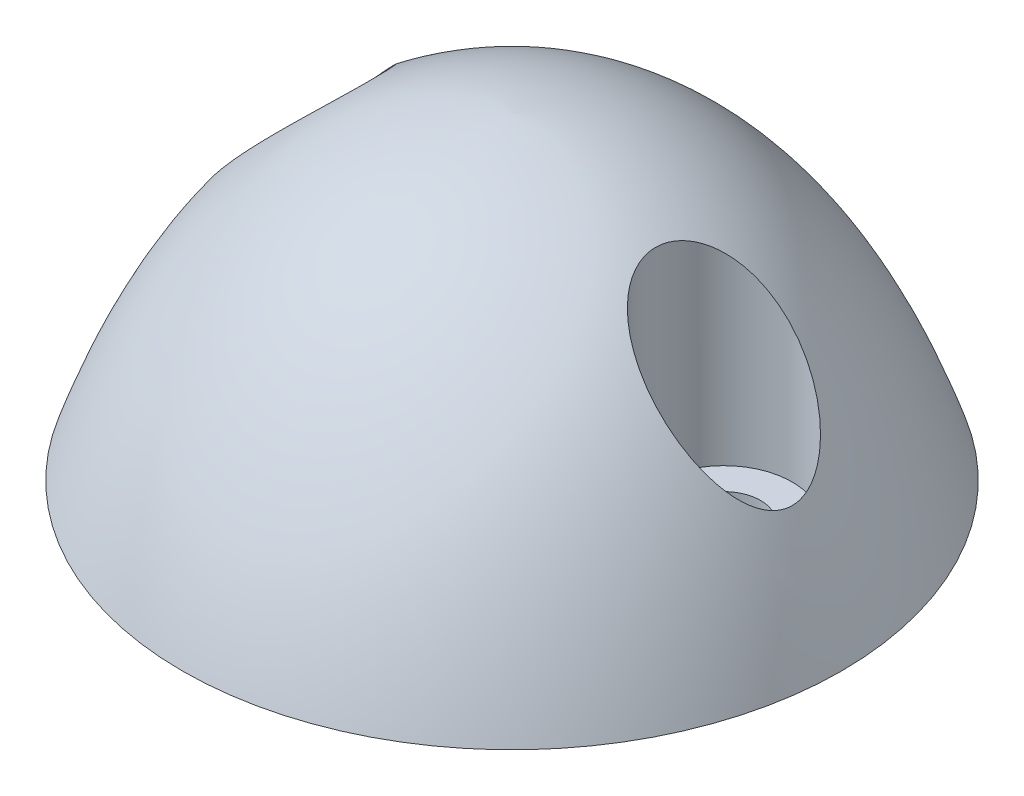
ISO-10303-21;
HEADER;
FILE_DESCRIPTION(('STEP AP214'),'2;1');
FILE_NAME('part.step','',(''),(''),'','','');
FILE_SCHEMA(('AUTOMOTIVE_DESIGN { 1 0 10303 214 1 1 1 1 }'));
ENDSEC;
DATA;
#1=APPLICATION_CONTEXT('core data for automotive mechanical design processes');
#2=APPLICATION_PROTOCOL_DEFINITION('international standard','automotive_design',2000,#1);
#3=PRODUCT_CONTEXT('',#1,'mechanical');
#4=PRODUCT('Part','Part','',(#3));
#5=PRODUCT_RELATED_PRODUCT_CATEGORY('part','',(#4));
#6=PRODUCT_DEFINITION_FORMATION('','',#4);
#7=PRODUCT_DEFINITION_CONTEXT('part definition',#1,'design');
#8=PRODUCT_DEFINITION('design','',#6,#7);
#9=PRODUCT_DEFINITION_SHAPE('','',#8);
#10=(LENGTH_UNIT() NAMED_UNIT(*) SI_UNIT(.MILLI.,.METRE.));
#11=(NAMED_UNIT(*) PLANE_ANGLE_UNIT() SI_UNIT($,.RADIAN.));
#12=(NAMED_UNIT(*) SI_UNIT($,.STERADIAN.) SOLID_ANGLE_UNIT());
#13=UNCERTAINTY_MEASURE_WITH_UNIT(LENGTH_MEASURE(1.E-05),#10,'distance_accuracy_value','');
#14=(GEOMETRIC_REPRESENTATION_CONTEXT(3) GLOBAL_UNCERTAINTY_ASSIGNED_CONTEXT((#13)) GLOBAL_UNIT_ASSIGNED_CONTEXT((#10,
#11,#12)) REPRESENTATION_CONTEXT('',''));
#15=CARTESIAN_POINT('',(0.,0.,0.));
#16=DIRECTION('',(0.,0.,1.));
#17=DIRECTION('',(1.,0.,0.));
#18=AXIS2_PLACEMENT_3D('',#15,#16,#17);
#19=CARTESIAN_POINT('',(-9.,20.,0.));
#20=DIRECTION('',(0.,-1.,0.));
#21=DIRECTION('',(0.,0.,-1.));
#22=AXIS2_PLACEMENT_3D('',#19,#20,#21);
#23=CYLINDRICAL_SURFACE('',#22,1.55);
#24=CARTESIAN_POINT('',(-9.,0.,0.));
#25=DIRECTION('',(0.,1.,0.));
#26=DIRECTION('',(0.,0.,-1.));
#27=AXIS2_PLACEMENT_3D('',#24,#25,#26);
#28=CIRCLE('',#27,1.55);
#29=CARTESIAN_POINT('',(-9.,0.,-1.55));
#30=VERTEX_POINT('',#29);
#31=EDGE_CURVE('E143',#30,#30,#28,.T.);
#32=ORIENTED_EDGE('',*,*,#31,.F.);
#33=EDGE_LOOP('',(#32));
#34=FACE_BOUND('',#33,.T.);
#35=CARTESIAN_POINT('',(-9.,3.,0.));
#36=DIRECTION('',(0.,1.,0.));
#37=DIRECTION('',(0.,0.,1.));
#38=AXIS2_PLACEMENT_3D('',#35,#36,#37);
#39=CIRCLE('',#38,1.55);
#40=CARTESIAN_POINT('',(-9.,3.,1.55));
#41=VERTEX_POINT('',#40);
#42=EDGE_CURVE('E124',#41,#41,#39,.T.);
#43=ORIENTED_EDGE('',*,*,#42,.T.);
#44=EDGE_LOOP('',(#43));
#45=FACE_BOUND('',#44,.T.);
#46=ADVANCED_FACE('F36',(#34,#45),#23,.F.);
#47=CARTESIAN_POINT('',(9.,20.,0.));
#48=DIRECTION('',(0.,-1.,0.));
#49=DIRECTION('',(0.,0.,-1.));
#50=AXIS2_PLACEMENT_3D('',#47,#48,#49);
#51=CYLINDRICAL_SURFACE('',#50,1.55);
#52=CARTESIAN_POINT('',(9.,0.,0.));
#53=DIRECTION('',(0.,1.,0.));
#54=DIRECTION('',(0.,0.,1.));
#55=AXIS2_PLACEMENT_3D('',#52,#53,#54);
#56=CIRCLE('',#55,1.55);
#57=CARTESIAN_POINT('',(9.,0.,1.55));
#58=VERTEX_POINT('',#57);
#59=EDGE_CURVE('E139',#58,#58,#56,.T.);
#60=ORIENTED_EDGE('',*,*,#59,.F.);
#61=EDGE_LOOP('',(#60));
#62=FACE_BOUND('',#61,.T.);
#63=CARTESIAN_POINT('',(9.,3.,0.));
#64=DIRECTION('',(0.,1.,0.));
#65=DIRECTION('',(0.,0.,1.));
#66=AXIS2_PLACEMENT_3D('',#63,#64,#65);
#67=CIRCLE('',#66,1.55);
#68=CARTESIAN_POINT('',(9.,3.,1.55));
#69=VERTEX_POINT('',#68);
#70=EDGE_CURVE('E126',#69,#69,#67,.T.);
#71=ORIENTED_EDGE('',*,*,#70,.T.);
#72=EDGE_LOOP('',(#71));
#73=FACE_BOUND('',#72,.T.);
#74=ADVANCED_FACE('F61',(#62,#73),#51,.F.);
#75=CARTESIAN_POINT('',(14.,0.,0.));
#76=CARTESIAN_POINT('',(9.75434257479276,12.950892032801,0.));
#77=CARTESIAN_POINT('',(0.,13.5,0.));
#78=B_SPLINE_CURVE_WITH_KNOTS('',2,(#75,#76,#77),.UNSPECIFIED.,.F.,.F.,(3,3),(0.,
0.755787305637426),.UNSPECIFIED.);
#79=CARTESIAN_POINT('',(0.,13.5,0.));
#80=DIRECTION('',(0.,1.,0.));
#81=AXIS1_PLACEMENT('',#79,#80);
#82=SURFACE_OF_REVOLUTION('',#78,#81);
#83=CARTESIAN_POINT('',(11.9,5.03290150704501,0.));
#84=CARTESIAN_POINT('',(11.8999995040046,5.03290226004967,0.0575568858720775));
#85=CARTESIAN_POINT('',(11.8982813229144,5.03535409608747,0.115121077812123));
#86=CARTESIAN_POINT('',(11.8914616033101,5.04507908203782,0.229664148234314));
#87=CARTESIAN_POINT('',(11.8863580285262,5.05235513365148,0.286642653474701));
#88=CARTESIAN_POINT('',(11.872907146739,5.07150977637272,0.399553128216967));
#89=CARTESIAN_POINT('',(11.8645529622686,5.08339812577846,0.455482613504032));
#90=CARTESIAN_POINT('',(11.8448344448537,5.11141478978463,0.565739911087259));
#91=CARTESIAN_POINT('',(11.8334682211272,5.12754576761097,0.620066693410804));
#92=CARTESIAN_POINT('',(11.792714499306,5.18527229662395,0.790732279385448));
#93=CARTESIAN_POINT('',(11.7580499235625,5.23422379358047,0.903394729899455));
#94=CARTESIAN_POINT('',(11.6784853399038,5.34589010844884,1.11751706674101));
#95=CARTESIAN_POINT('',(11.6335746123927,5.40861933814031,1.21896505422312));
#96=CARTESIAN_POINT('',(11.5475295488657,5.52795449122324,1.38810470297556));
#97=CARTESIAN_POINT('',(11.5080079693762,5.58250819283202,1.45811047024882));
#98=CARTESIAN_POINT('',(11.42521958617,5.69613318024085,1.59201508297687));
#99=CARTESIAN_POINT('',(11.3819508483381,5.75520679716404,1.65591073843177));
#100=CARTESIAN_POINT('',(11.2922410035893,5.87694345513667,1.77802731405435));
#101=CARTESIAN_POINT('',(11.2457943988602,5.93961268485598,1.83623795403757));
#102=CARTESIAN_POINT('',(11.1502617746131,6.06769619684007,1.94723797681841));
#103=CARTESIAN_POINT('',(11.1011748939948,6.13311137312243,2.00002557440872));
#104=CARTESIAN_POINT('',(10.9707094187621,6.305832306879,2.13053990078735));
#105=CARTESIAN_POINT('',(10.8875671757691,6.41480535337763,2.2043131059503));
#106=CARTESIAN_POINT('',(10.7165788326061,6.63644901559209,2.33992847582749));
#107=CARTESIAN_POINT('',(10.6287300465817,6.74912172806716,2.40176373331069));
#108=CARTESIAN_POINT('',(10.4490309695116,6.97699478046377,2.51426994545458));
#109=CARTESIAN_POINT('',(10.3571770786878,7.09219734605431,2.56493059791662));
#110=CARTESIAN_POINT('',(10.1701452769849,7.32406718010042,2.6554756805126));
#111=CARTESIAN_POINT('',(10.0749679821283,7.44073417456999,2.69536209589872));
#112=CARTESIAN_POINT('',(9.87739154858158,7.68009120807085,2.76616823983219));
#113=CARTESIAN_POINT('',(9.77486027344762,7.80281566009319,2.79660265234559));
#114=CARTESIAN_POINT('',(9.56715900286346,8.04835924926728,2.84600173411843));
#115=CARTESIAN_POINT('',(9.46198873312454,8.17117839496452,2.86496520593894));
#116=CARTESIAN_POINT('',(9.24957393129934,8.41616784239128,2.89122090802685));
#117=CARTESIAN_POINT('',(9.14233047258101,8.53833844023502,2.8985190223286));
#118=CARTESIAN_POINT('',(8.92628770747958,8.78140738826954,2.90107506219991));
#119=CARTESIAN_POINT('',(8.81748862847892,8.90230592000105,2.896334729876));
#120=CARTESIAN_POINT('',(8.61199355814732,9.12784336282508,2.87555249191891));
#121=CARTESIAN_POINT('',(8.51540020508739,9.23270312602553,2.86092458357419));
#122=CARTESIAN_POINT('',(8.32209546554788,9.44030517391013,2.82137985079996));
#123=CARTESIAN_POINT('',(8.22538407244338,9.54304733335419,2.79646241964657));
#124=CARTESIAN_POINT('',(7.93619523259951,9.84699766331794,2.70539063195993));
#125=CARTESIAN_POINT('',(7.74426572005998,10.0443652409202,2.62288206651332));
#126=CARTESIAN_POINT('',(7.42421227937834,10.3670691331181,2.43936049391355));
#127=CARTESIAN_POINT('',(7.29357375799181,10.4968316224509,2.35043815627106));
#128=CARTESIAN_POINT('',(7.04189937685823,10.7436097469304,2.14525345401028));
#129=CARTESIAN_POINT('',(6.92085030648059,10.8606430041146,2.02902960828574));
#130=CARTESIAN_POINT('',(6.72051281177229,11.0522047445567,1.7976967701513));
#131=CARTESIAN_POINT('',(6.63799825520511,11.1303382921376,1.68838570589615));
#132=CARTESIAN_POINT('',(6.4862838503991,11.2729744063817,1.45285213396045));
#133=CARTESIAN_POINT('',(6.41706813508356,11.3374932261626,1.3266500882188));
#134=CARTESIAN_POINT('',(6.30639710237747,11.4401117670638,1.0814153834397));
#135=CARTESIAN_POINT('',(6.26223606365433,11.4808242087681,0.964705778915558));
#136=CARTESIAN_POINT('',(6.18870295877073,11.5484156237527,0.722873049050717));
#137=CARTESIAN_POINT('',(6.15932314563794,11.5753018436432,0.59775437004307));
#138=CARTESIAN_POINT('',(6.11728138156712,11.6137271740099,0.341790474398184));
#139=CARTESIAN_POINT('',(6.10469629176645,11.6251957272083,0.210921741889061));
#140=CARTESIAN_POINT('',(6.09748911061471,11.6317671435189,-0.0517177970447902));
#141=CARTESIAN_POINT('',(6.10286374222704,11.6268729922664,-0.183488434524143));
#142=CARTESIAN_POINT('',(6.13003147631084,11.6020762132863,-0.433439045067222));
#143=CARTESIAN_POINT('',(6.15052839634535,11.5833583415724,-0.551884194652133));
#144=CARTESIAN_POINT('',(6.20512330549232,11.533331640864,-0.782781415397064));
#145=CARTESIAN_POINT('',(6.23922262483345,11.5020215804306,-0.895232899194845));
#146=CARTESIAN_POINT('',(6.32124168574624,11.42636170307,-1.11759801277993));
#147=CARTESIAN_POINT('',(6.36978827522938,11.3814181093387,-1.22707506413123));
#148=CARTESIAN_POINT('',(6.47747036539064,11.2811239211568,-1.43549071241328));
#149=CARTESIAN_POINT('',(6.53661188450636,11.2257674107622,-1.53442326834299));
#150=CARTESIAN_POINT('',(6.69391632522174,11.077489336817,-1.76635133409484));
#151=CARTESIAN_POINT('',(6.79710345559261,10.9793608211182,-1.89263106395647));
#152=CARTESIAN_POINT('',(7.01557837077803,10.7690312516977,-2.12064277957733));
#153=CARTESIAN_POINT('',(7.13089249203731,10.6567994621811,-2.2223196867994));
#154=CARTESIAN_POINT('',(7.41397371211287,10.377586384592,-2.43656974789653));
#155=CARTESIAN_POINT('',(7.58506184969193,10.2059716160231,-2.53867744586831));
#156=CARTESIAN_POINT('',(7.93287815216935,9.8501545001175,-2.70340022901078));
#157=CARTESIAN_POINT('',(8.10961342663572,9.66593592310586,-2.76596329076319));
#158=CARTESIAN_POINT('',(8.40504277555176,9.35177508624945,-2.84094328587919));
#159=CARTESIAN_POINT('',(8.52367028973248,9.22395281755344,-2.86309133018028));
#160=CARTESIAN_POINT('',(8.76009393047977,8.9657632850277,-2.89251518105661));
#161=CARTESIAN_POINT('',(8.87788975717318,8.83539516128184,-2.89978587160415));
#162=CARTESIAN_POINT('',(9.11194662487995,8.57285428163703,-2.90020522777573));
#163=CARTESIAN_POINT('',(9.22820431818485,8.44067856335935,-2.89332698982772));
#164=CARTESIAN_POINT('',(9.45823718061007,8.17562720564306,-2.86590890298483));
#165=CARTESIAN_POINT('',(9.57201269873692,8.04275166790694,-2.84537098766408));
#166=CARTESIAN_POINT('',(9.79829571018505,7.77496136597528,-2.79043050792275));
#167=CARTESIAN_POINT('',(9.91075217304876,7.64004872724085,-2.75580705503008));
#168=CARTESIAN_POINT('',(10.1318318510806,7.37129325698135,-2.67262278312493));
#169=CARTESIAN_POINT('',(10.2404538780307,7.23745076684238,-2.62405768570794));
#170=CARTESIAN_POINT('',(10.4527688013552,6.97244371475256,-2.51272649215602));
#171=CARTESIAN_POINT('',(10.556475060083,6.84127252066054,-2.45000192465136));
#172=CARTESIAN_POINT('',(10.7582585417007,6.58286209454022,-2.30946665529553));
#173=CARTESIAN_POINT('',(10.8563404094278,6.45561965927966,-2.23166864115529));
#174=CARTESIAN_POINT('',(11.0448234007733,6.20820520126674,-2.06029149472453));
#175=CARTESIAN_POINT('',(11.1352811881499,6.08798352992978,-1.96684777668241));
#176=CARTESIAN_POINT('',(11.3073420294809,5.85682886918703,-1.76183817791076));
#177=CARTESIAN_POINT('',(11.3889511105228,5.74588956922313,-1.65028476315387));
#178=CARTESIAN_POINT('',(11.5248547528227,5.55940285070756,-1.43116551376374));
#179=CARTESIAN_POINT('',(11.5813493862281,5.48121204395829,-1.32725258017546));
#180=CARTESIAN_POINT('',(11.6837544040384,5.33858319837821,-1.10558161710211));
#181=CARTESIAN_POINT('',(11.7296826341018,5.27412198543189,-0.987847446045542));
#182=CARTESIAN_POINT('',(11.7966797170578,5.17967019789641,-0.773004766691707));
#183=CARTESIAN_POINT('',(11.8211122976449,5.1450730008013,-0.67901684231861));
#184=CARTESIAN_POINT('',(11.8508492614395,5.1028740056708,-0.5339467380487));
#185=CARTESIAN_POINT('',(11.8596056617471,5.09042944853154,-0.484946498380702));
#186=CARTESIAN_POINT('',(11.8746555313529,5.06902210293588,-0.385828198747395));
#187=CARTESIAN_POINT('',(11.8809500699978,5.06005780278998,-0.335710634130438));
#188=CARTESIAN_POINT('',(11.8905933703735,5.04631743021795,-0.238134399020383));
#189=CARTESIAN_POINT('',(11.8941134537166,5.0412978462236,-0.190726895765388));
#190=CARTESIAN_POINT('',(11.8988172969419,5.03458911230848,-0.095548004241633));
#191=CARTESIAN_POINT('',(11.9000004117133,5.03290088199484,-0.047776519149393));
#192=CARTESIAN_POINT('',(11.9,5.03290150704501,0.));
#193=B_SPLINE_CURVE_WITH_KNOTS('',3,(#83,#84,#85,#86,#87,#88,#89,#90,#91,#92,#93,#94,#95,#96,
#97,#98,#99,#100,#101,#102,#103,#104,#105,#106,#107,#108,#109,#110,#111,#112,#113,#114,#115,
#116,#117,#118,#119,#120,#121,#122,#123,#124,#125,#126,#127,#128,#129,#130,#131,#132,#133,#134,
#135,#136,#137,#138,#139,#140,#141,#142,#143,#144,#145,#146,#147,#148,#149,#150,#151,#152,#153,
#154,#155,#156,#157,#158,#159,#160,#161,#162,#163,#164,#165,#166,#167,#168,#169,#170,#171,#172,
#173,#174,#175,#176,#177,#178,#179,#180,#181,#182,#183,#184,#185,#186,#187,#188,#189,#190,#191,
#192),.UNSPECIFIED.,.T.,.F.,(4,2,2,2,2,2,2,2,2,2,2,2,2,2,2,2,2,2,2,2,2,2,2,2,2,2,2,2,2,2,2,2,2,
2,2,2,2,2,2,2,2,2,2,2,2,2,2,2,2,2,2,2,2,2,4),(0.,0.172606638086496,0.345317191055014,
0.518395160362628,0.691582036321827,1.07223850390679,1.45329505819107,1.74436460868284,
2.03558530202011,2.32732321892387,2.61915686714067,3.08543112294399,3.55197435921418,
4.01894593424168,4.4858314066814,4.97376557624021,5.46175067192655,5.94948954899662,
6.43715784846712,6.86671585488696,7.29629919390324,8.15371061882406,8.76525661285859,
9.37594492261122,9.84727471254404,10.318038610359,10.7101756087908,11.1021068700587,
11.4958257249137,11.8894727434295,12.2528067961836,12.6161763894254,12.9984550148206,
13.3809514857205,13.9487416747951,14.5177914577979,15.3024264797262,16.0880916008878,
16.6148404999769,17.141770507173,17.6697033749526,18.1975615279266,18.734037827224,
19.270678936401,19.8057661096245,20.3404048275818,20.8706351291568,21.400501977617,
21.8245484007901,22.247873304218,22.5558559888926,22.709619549754,22.8633162467272,
23.006553128726,23.1498295451774),.UNSPECIFIED.);
#194=CARTESIAN_POINT('',(11.9,5.03290150704501,0.));
#195=VERTEX_POINT('',#194);
#196=EDGE_CURVE('E42',#195,#195,#193,.T.);
#197=ORIENTED_EDGE('',*,*,#196,.T.);
#198=EDGE_LOOP('',(#197));
#199=FACE_BOUND('',#198,.T.);
#200=CARTESIAN_POINT('',(-9.,8.69842329847387,2.9));
#201=CARTESIAN_POINT('',(-9.12448510729692,8.55873330846458,2.9000001011647));
#202=CARTESIAN_POINT('',(-9.24796583434249,8.41816990724993,2.89199885836156));
#203=CARTESIAN_POINT('',(-9.49215204243595,8.13622368675681,2.86058538998337));
#204=CARTESIAN_POINT('',(-9.61285592943217,7.99484045241448,2.83716453047458));
#205=CARTESIAN_POINT('',(-9.85083651934552,7.71214669285684,2.77510813407083));
#206=CARTESIAN_POINT('',(-9.96810759645478,7.57083662320212,2.73644897638312));
#207=CARTESIAN_POINT('',(-10.1982127414698,7.28971006085866,2.64379787619063));
#208=CARTESIAN_POINT('',(-10.3110490570052,7.14989283843299,2.58981381779027));
#209=CARTESIAN_POINT('',(-10.4949257596172,6.91897707961231,2.48643110183772));
#210=CARTESIAN_POINT('',(-10.5674402219199,6.8270683979875,2.44142725208581));
#211=CARTESIAN_POINT('',(-10.7097420841086,6.64511767381186,2.34397514824067));
#212=CARTESIAN_POINT('',(-10.7795301076142,6.55507520663945,2.29152860938174));
#213=CARTESIAN_POINT('',(-10.9158279299489,6.37771909841621,2.17885493054948));
#214=CARTESIAN_POINT('',(-10.9823436918103,6.29040060846993,2.11864272687756));
#215=CARTESIAN_POINT('',(-11.1116233239222,6.11930646246552,1.98981611803067));
#216=CARTESIAN_POINT('',(-11.1743888073324,6.03552928773523,1.92120536472756));
#217=CARTESIAN_POINT('',(-11.3121848766939,5.85019068635881,1.75457482430437));
#218=CARTESIAN_POINT('',(-11.3858018700371,5.75012491967928,1.65367129624899));
#219=CARTESIAN_POINT('',(-11.5231718207271,5.56178655953503,1.43533783139592));
#220=CARTESIAN_POINT('',(-11.586937518179,5.47349875484772,1.31792962109465));
#221=CARTESIAN_POINT('',(-11.6855542424866,5.33601177605859,1.0991349686905));
#222=CARTESIAN_POINT('',(-11.7235818340442,5.28266652715065,1.00182109634282));
#223=CARTESIAN_POINT('',(-11.7900815656988,5.18901205963675,0.798044472561981));
#224=CARTESIAN_POINT('',(-11.8185688571437,5.14868217452862,0.691596568325083));
#225=CARTESIAN_POINT('',(-11.8598273659685,5.09013353105925,0.490003722057058));
#226=CARTESIAN_POINT('',(-11.8744433791839,5.06932650430412,0.395998621332511));
#227=CARTESIAN_POINT('',(-11.8943303993547,5.04099479902677,0.205041413451809));
#228=CARTESIAN_POINT('',(-11.8996083113375,5.03346030619202,0.108091537805095));
#229=CARTESIAN_POINT('',(-11.9003498519939,5.03240239543953,-0.0860615957148231));
#230=CARTESIAN_POINT('',(-11.8957997329298,5.03889860407731,-0.183265018306169));
#231=CARTESIAN_POINT('',(-11.8772790244393,5.06528896878518,-0.374912098258223));
#232=CARTESIAN_POINT('',(-11.86330166158,5.08519275812969,-0.469353720337511));
#233=CARTESIAN_POINT('',(-11.8228365300349,5.14263647838467,-0.674454364161071));
#234=CARTESIAN_POINT('',(-11.7942091206407,5.18318211229241,-0.783840027486329));
#235=CARTESIAN_POINT('',(-11.7268878561303,5.27802567647299,-0.993092269941708));
#236=CARTESIAN_POINT('',(-11.6881755433804,5.33234881780208,-1.0929409314527));
#237=CARTESIAN_POINT('',(-11.5824030438294,5.47983248779801,-1.32853261541468));
#238=CARTESIAN_POINT('',(-11.5106767994087,5.57908630945384,-1.45835381689625));
#239=CARTESIAN_POINT('',(-11.3943311705771,5.73830486614203,-1.63776458755625));
#240=CARTESIAN_POINT('',(-11.3540232669175,5.79319025517631,-1.69508863475426));
#241=CARTESIAN_POINT('',(-11.2708793833188,5.90577363488374,-1.80495071907319));
#242=CARTESIAN_POINT('',(-11.2280439463663,5.96347102099915,-1.85748977802263));
#243=CARTESIAN_POINT('',(-11.1132205591229,6.11723261687759,-1.98895228563047));
#244=CARTESIAN_POINT('',(-11.0394900870734,6.21509082863494,-2.06425518541376));
#245=CARTESIAN_POINT('',(-10.887458097297,6.41487047950113,-2.20412600179048));
#246=CARTESIAN_POINT('',(-10.8091539432783,6.51679425106915,-2.26868764290317));
#247=CARTESIAN_POINT('',(-10.6486218005365,6.72360907988575,-2.38789768584219));
#248=CARTESIAN_POINT('',(-10.5663876114612,6.82850471202094,-2.44252972292443));
#249=CARTESIAN_POINT('',(-10.39869142744,7.04016885655036,-2.5422778254084));
#250=CARTESIAN_POINT('',(-10.3132297686568,7.14693717327496,-2.5873948786539));
#251=CARTESIAN_POINT('',(-10.1135896772915,7.39368643560337,-2.68056178296421));
#252=CARTESIAN_POINT('',(-9.99844656022324,7.53407839372526,-2.72547517734341));
#253=CARTESIAN_POINT('',(-9.76421764548896,7.81564547944351,-2.80019355126723));
#254=CARTESIAN_POINT('',(-9.64513051416806,7.95682085823639,-2.82999336347353));
#255=CARTESIAN_POINT('',(-9.40383847881979,8.23880520032355,-2.87436146910663));
#256=CARTESIAN_POINT('',(-9.28163488661342,8.37961429116752,-2.88893606635744));
#257=CARTESIAN_POINT('',(-9.03489368597974,8.65987744341655,-2.90242039513778));
#258=CARTESIAN_POINT('',(-8.91035687921974,8.79933194611392,-2.90133541201009));
#259=CARTESIAN_POINT('',(-8.68693824259828,9.04597178500572,-2.88473147836369));
#260=CARTESIAN_POINT('',(-8.58832917763504,9.15361704416557,-2.8723829234742));
#261=CARTESIAN_POINT('',(-8.39081074220017,9.3668700690969,-2.83706930075181));
#262=CARTESIAN_POINT('',(-8.29190129645239,9.47247726514322,-2.8141013078662));
#263=CARTESIAN_POINT('',(-7.99601656987991,9.78494322230222,-2.72839506718531));
#264=CARTESIAN_POINT('',(-7.79935439930493,9.98803124773744,-2.6488222489451));
#265=CARTESIAN_POINT('',(-7.47172243862462,10.3195723758196,-2.46948304527565));
#266=CARTESIAN_POINT('',(-7.33832095095661,10.4525186293702,-2.38237381573766));
#267=CARTESIAN_POINT('',(-7.08079716527253,10.7057807401837,-2.18022249701755));
#268=CARTESIAN_POINT('',(-6.95666307301617,10.826112732791,-2.06521673140881));
#269=CARTESIAN_POINT('',(-6.75080997942218,11.0233942587739,-1.83552803242699));
#270=CARTESIAN_POINT('',(-6.66589653138417,11.1039608132096,-1.72683430654452));
#271=CARTESIAN_POINT('',(-6.50926686181718,11.2514734219483,-1.492008944954));
#272=CARTESIAN_POINT('',(-6.43753437260492,11.3184362766035,-1.36589914531352));
#273=CARTESIAN_POINT('',(-6.32255645305477,11.4251764808895,-1.12086496795616));
#274=CARTESIAN_POINT('',(-6.27653436269791,11.4676476416399,-1.00442627377986));
#275=CARTESIAN_POINT('',(-6.19922643437051,11.538766948671,-0.762713014147444));
#276=CARTESIAN_POINT('',(-6.16793287775602,11.5674223354468,-0.637443116443457));
#277=CARTESIAN_POINT('',(-6.1221223246944,11.6093106283949,-0.380658401453586));
#278=CARTESIAN_POINT('',(-6.10768821620221,11.6224673394075,-0.249116011926466));
#279=CARTESIAN_POINT('',(-6.09702610249772,11.6321896881081,0.0153129339856148));
#280=CARTESIAN_POINT('',(-6.10079379144253,11.6287592496754,0.148199165047576));
#281=CARTESIAN_POINT('',(-6.12514683303992,11.606536433718,0.399845142024661));
#282=CARTESIAN_POINT('',(-6.1443144555643,11.5890389924552,0.518863786472987));
#283=CARTESIAN_POINT('',(-6.19643761995362,11.5413004798469,0.7511413042901));
#284=CARTESIAN_POINT('',(-6.22939442241935,11.5110582433761,0.864399649992914));
#285=CARTESIAN_POINT('',(-6.30902777359417,11.4376519041741,1.08782886011366));
#286=CARTESIAN_POINT('',(-6.35625825023303,11.3939644497066,1.19762737846344));
#287=CARTESIAN_POINT('',(-6.4614159382425,11.296118733526,1.40688777999697));
#288=CARTESIAN_POINT('',(-6.5193486309413,11.2419551055854,1.50634432537674));
#289=CARTESIAN_POINT('',(-6.67321457615494,11.0971004184923,1.73886790734485));
#290=CARTESIAN_POINT('',(-6.77412781675902,11.0012788093418,1.86546285294304));
#291=CARTESIAN_POINT('',(-6.98821672952603,10.7955326700133,2.09462259189682));
#292=CARTESIAN_POINT('',(-7.10142123492332,10.6855748625276,2.19712901579074));
#293=CARTESIAN_POINT('',(-7.37955123807355,10.4118575045609,2.41368231755852));
#294=CARTESIAN_POINT('',(-7.54786723654031,10.2434590503017,2.51747435129955));
#295=CARTESIAN_POINT('',(-7.89033474347203,9.89412389891072,2.6861004728214));
#296=CARTESIAN_POINT('',(-8.06448860942675,9.71318210415313,2.75091861682486));
#297=CARTESIAN_POINT('',(-8.36631443019452,9.39334703958306,2.83298939941445));
#298=CARTESIAN_POINT('',(-8.49383965805994,9.25629252572266,2.85835975277461));
#299=CARTESIAN_POINT('',(-8.74791691877183,8.97926213668433,2.89186345249751));
#300=CARTESIAN_POINT('',(-8.87446912251549,8.83928679132402,2.89999989798544));
#301=CARTESIAN_POINT('',(-9.,8.69842329847387,2.9));
#302=B_SPLINE_CURVE_WITH_KNOTS('',3,(#200,#201,#202,#203,#204,#205,#206,#207,#208,#209,#210,
#211,#212,#213,#214,#215,#216,#217,#218,#219,#220,#221,#222,#223,#224,#225,#226,#227,#228,#229,
#230,#231,#232,#233,#234,#235,#236,#237,#238,#239,#240,#241,#242,#243,#244,#245,#246,#247,#248,
#249,#250,#251,#252,#253,#254,#255,#256,#257,#258,#259,#260,#261,#262,#263,#264,#265,#266,#267,
#268,#269,#270,#271,#272,#273,#274,#275,#276,#277,#278,#279,#280,#281,#282,#283,#284,#285,#286,
#287,#288,#289,#290,#291,#292,#293,#294,#295,#296,#297,#298,#299,#300,#301),.UNSPECIFIED.,.T.,
.F.,(4,2,2,2,2,2,2,2,2,2,2,2,2,2,2,2,2,2,2,2,2,2,2,2,2,2,2,2,2,2,2,2,2,2,2,2,2,2,2,2,2,2,2,2,2,
2,2,2,2,2,4),(0.,0.561140498625367,1.12259546518618,1.68492418396424,2.24696412771572,
2.62300443142193,2.99895821358937,3.37419938781156,3.74927797477348,4.22817150935372,
4.70644043893967,5.05721191953259,5.40742365391509,5.69831099534556,5.98898315107284,
6.28006217082226,6.57135055266486,6.929714344802,7.28873868817006,7.82096530035851,
8.08787553990295,8.35472864677744,8.7855243294195,9.2165708232622,9.64832139734102,
10.0800271250688,10.6404506174283,11.2010655897968,11.7614483539156,12.3216419848874,
12.7607571949328,13.1999934284277,14.0761175276284,14.6967297645114,15.3165382107832,
15.7940307565724,16.2709299730431,16.6659245867286,17.0607119681824,17.4574322236706,
17.8540586350511,18.2178580943096,18.5816908192244,18.9620069884954,19.3425184861477,
19.9037553867706,20.4663385249426,21.241327204076,22.0166327069899,22.5825889982972,
23.1484435066323),.UNSPECIFIED.);
#303=CARTESIAN_POINT('',(-9.,8.69842329847387,2.9));
#304=VERTEX_POINT('',#303);
#305=EDGE_CURVE('E118',#304,#304,#302,.T.);
#306=ORIENTED_EDGE('',*,*,#305,.T.);
#307=EDGE_LOOP('',(#306));
#308=FACE_BOUND('',#307,.T.);
#309=CARTESIAN_POINT('',(0.,13.5,0.));
#310=VERTEX_POINT('',#309);
#311=VERTEX_LOOP('',#310);
#312=FACE_BOUND('',#311,.T.);
#313=CARTESIAN_POINT('',(0.,0.,0.));
#314=DIRECTION('',(0.,1.,0.));
#315=DIRECTION('',(-1.,0.,0.));
#316=AXIS2_PLACEMENT_3D('',#313,#314,#315);
#317=CIRCLE('',#316,14.);
#318=CARTESIAN_POINT('',(-14.,0.,0.));
#319=VERTEX_POINT('',#318);
#320=EDGE_CURVE('E65',#319,#319,#317,.T.);
#321=ORIENTED_EDGE('',*,*,#320,.T.);
#322=EDGE_LOOP('',(#321));
#323=FACE_BOUND('',#322,.T.);
#324=ADVANCED_FACE('F38',(#199,#308,#312,#323),#82,.T.);
#325=CARTESIAN_POINT('',(0.,12.,0.));
#326=CARTESIAN_POINT('',(4.17736526271381,12.4645844753591,0.));
#327=CARTESIAN_POINT('',(11.7262559776133,7.4899369642375,0.));
#328=CARTESIAN_POINT('',(12.5,0.,0.));
#329=B_SPLINE_CURVE_WITH_KNOTS('',3,(#325,#326,#327,#328),.UNSPECIFIED.,.F.,.F.,(4,4),(0.,
0.828663254876346),.UNSPECIFIED.);
#330=CARTESIAN_POINT('',(0.,13.5,0.));
#331=DIRECTION('',(0.,1.,0.));
#332=AXIS1_PLACEMENT('',#330,#331);
#333=SURFACE_OF_REVOLUTION('',#329,#332);
#334=CARTESIAN_POINT('',(0.,0.,0.));
#335=DIRECTION('',(0.,1.,0.));
#336=DIRECTION('',(-1.,0.,0.));
#337=AXIS2_PLACEMENT_3D('',#334,#335,#336);
#338=CIRCLE('',#337,12.5);
#339=CARTESIAN_POINT('',(-12.5,0.,0.));
#340=VERTEX_POINT('',#339);
#341=EDGE_CURVE('E67',#340,#340,#338,.T.);
#342=ORIENTED_EDGE('',*,*,#341,.F.);
#343=EDGE_LOOP('',(#342));
#344=FACE_BOUND('',#343,.T.);
#345=CARTESIAN_POINT('',(0.,12.,0.));
#346=VERTEX_POINT('',#345);
#347=VERTEX_LOOP('',#346);
#348=FACE_BOUND('',#347,.T.);
#349=CARTESIAN_POINT('',(6.,10.1219227652547,0.));
#350=CARTESIAN_POINT('',(6.00000721455781,10.1219158068844,-0.122288222638642));
#351=CARTESIAN_POINT('',(6.0075301596372,10.1145460653656,-0.244637556977931));
#352=CARTESIAN_POINT('',(6.03710469007431,10.0855618855409,-0.485859523799262));
#353=CARTESIAN_POINT('',(6.05916787274445,10.0639360765731,-0.60472930187428));
#354=CARTESIAN_POINT('',(6.11657222597893,10.0076260508299,-0.836796714382408));
#355=CARTESIAN_POINT('',(6.15199923485649,9.97285741216513,-0.949952199927794));
#356=CARTESIAN_POINT('',(6.23415882557535,9.89212325876606,-1.16777741017953));
#357=CARTESIAN_POINT('',(6.28089604652977,9.84615314946756,-1.27244362925966));
#358=CARTESIAN_POINT('',(6.40641182861893,9.72247064047313,-1.51641899070028));
#359=CARTESIAN_POINT('',(6.49022185662496,9.63970908647565,-1.65059207515511));
#360=CARTESIAN_POINT('',(6.6717704049652,9.45967180885149,-1.89816566971014));
#361=CARTESIAN_POINT('',(6.76953757307836,9.36236621300155,-2.01152233093347));
#362=CARTESIAN_POINT('',(7.01276634698322,9.11883776924356,-2.25625810548892));
#363=CARTESIAN_POINT('',(7.16245650837899,8.96786858466182,-2.37869628390889));
#364=CARTESIAN_POINT('',(7.47165117020303,8.65235040508111,-2.5882715204715));
#365=CARTESIAN_POINT('',(7.6311708841335,8.4877802178958,-2.67535218946541));
#366=CARTESIAN_POINT('',(8.01425393549743,8.08642474567398,-2.84372586082122));
#367=CARTESIAN_POINT('',(8.23967162647256,7.84545278091534,-2.9109514819374));
#368=CARTESIAN_POINT('',(8.57550435706274,7.47622522365346,-2.97199787047853));
#369=CARTESIAN_POINT('',(8.68713858386561,7.35177046350607,-2.98571057986704));
#370=CARTESIAN_POINT('',(8.90882721769022,7.10071129682434,-3.00067032740606));
#371=CARTESIAN_POINT('',(9.01888167593289,6.97410696027769,-3.00191777063436));
#372=CARTESIAN_POINT('',(9.35054602612587,6.58576328041981,-2.98778513825465));
#373=CARTESIAN_POINT('',(9.56839536156789,6.32123102236417,-2.95364212663138));
#374=CARTESIAN_POINT('',(9.88293763640517,5.92218483595988,-2.86918804888712));
#375=CARTESIAN_POINT('',(9.9858328308449,5.78867459412281,-2.83545174871504));
#376=CARTESIAN_POINT('',(10.1870102981635,5.52125902215657,-2.75728932674219));
#377=CARTESIAN_POINT('',(10.2852926910704,5.38735370240407,-2.71286348327469));
#378=CARTESIAN_POINT('',(10.4969102669324,5.09132078481968,-2.60313799983664));
#379=CARTESIAN_POINT('',(10.6090269312422,4.92922026862089,-2.53541036776273));
#380=CARTESIAN_POINT('',(10.8247545816046,4.60612333285625,-2.38486854208305));
#381=CARTESIAN_POINT('',(10.9283597227576,4.44512774043834,-2.30204410500781));
#382=CARTESIAN_POINT('',(11.0765901107496,4.20573535310097,-2.16616319490101));
#383=CARTESIAN_POINT('',(11.1248284876674,4.12624506591096,-2.11889974586643));
#384=CARTESIAN_POINT('',(11.2187586504636,3.96827778154497,-2.02033336830617));
#385=CARTESIAN_POINT('',(11.2644508481869,3.8898006220824,-1.96903109631885));
#386=CARTESIAN_POINT('',(11.353085122071,3.7343158330679,-1.86220389604112));
#387=CARTESIAN_POINT('',(11.3960299587262,3.65730678480965,-1.80668333297251));
#388=CARTESIAN_POINT('',(11.479008411525,3.505231161314,-1.69103033339696));
#389=CARTESIAN_POINT('',(11.5190429318907,3.43016398745463,-1.63089934136287));
#390=CARTESIAN_POINT('',(11.592251652748,3.28980920248347,-1.51150697170016));
#391=CARTESIAN_POINT('',(11.6257155239329,3.22427435832509,-1.4527157847748));
#392=CARTESIAN_POINT('',(11.6897705503312,3.09626898933268,-1.33037742142199));
#393=CARTESIAN_POINT('',(11.72036165793,3.03379851529721,-1.26683016619648));
#394=CARTESIAN_POINT('',(11.778030707697,2.91367515540969,-1.13476963858931));
#395=CARTESIAN_POINT('',(11.8051333011807,2.85598962197744,-1.06629723107981));
#396=CARTESIAN_POINT('',(11.8554673630621,2.74685577933824,-0.923074559055306));
#397=CARTESIAN_POINT('',(11.8786981155896,2.69540862403175,-0.84832313743866));
#398=CARTESIAN_POINT('',(11.9164888577247,2.6103692286474,-0.706033360853112));
#399=CARTESIAN_POINT('',(11.9318573063278,2.57523106813134,-0.639647379840508));
#400=CARTESIAN_POINT('',(11.958488905692,2.51370525413938,-0.502202723069405));
#401=CARTESIAN_POINT('',(11.9697627232636,2.48729488057716,-0.431156765961908));
#402=CARTESIAN_POINT('',(11.9829896209749,2.45611411963153,-0.321198391538917));
#403=CARTESIAN_POINT('',(11.9867986756927,2.44709192668558,-0.283691864316831));
#404=CARTESIAN_POINT('',(11.9930258855181,2.43230783225832,-0.207936267550413));
#405=CARTESIAN_POINT('',(11.9954447923599,2.42654416872753,-0.169687610909111));
#406=CARTESIAN_POINT('',(11.9988112368624,2.41851556016861,-0.0927903100462407));
#407=CARTESIAN_POINT('',(11.9997600914221,2.41624748374105,-0.05414205507797));
#408=CARTESIAN_POINT('',(12.0001601020063,2.41529137823632,0.0231957796724803));
#409=CARTESIAN_POINT('',(11.999611373815,2.41660307239261,0.0618853560287569));
#410=CARTESIAN_POINT('',(11.9960575595302,2.42508709024743,0.167835567612357));
#411=CARTESIAN_POINT('',(11.9915201003588,2.43591411259803,0.234783874647969));
#412=CARTESIAN_POINT('',(11.9783309627203,2.46712709141683,0.365947632481567));
#413=CARTESIAN_POINT('',(11.9696746273887,2.48752386722979,0.430159900113784));
#414=CARTESIAN_POINT('',(11.9433603426662,2.5488272936743,0.588247028351007));
#415=CARTESIAN_POINT('',(11.9233635598291,2.59487199820322,0.679715152720791));
#416=CARTESIAN_POINT('',(11.8772762291634,2.69863456380178,0.854096564158163));
#417=CARTESIAN_POINT('',(11.8511660125823,2.75639001976133,0.936980966434964));
#418=CARTESIAN_POINT('',(11.7953939175539,2.87684307164054,1.09190398964322));
#419=CARTESIAN_POINT('',(11.7659202327923,2.93924318903219,1.16424701761335));
#420=CARTESIAN_POINT('',(11.7033341138196,3.06871284502303,1.30298967508853));
#421=CARTESIAN_POINT('',(11.6702183391435,3.13578664924271,1.36938374532244));
#422=CARTESIAN_POINT('',(11.6007699465194,3.27325478940393,1.49709187712553));
#423=CARTESIAN_POINT('',(11.5644315511382,3.34365497879657,1.55839641733252));
#424=CARTESIAN_POINT('',(11.4888870097409,3.48675817417144,1.67640984080964));
#425=CARTESIAN_POINT('',(11.4496798652823,3.55946197686626,1.73311710942626));
#426=CARTESIAN_POINT('',(11.370998791606,3.70222295224478,1.83914733868906));
#427=CARTESIAN_POINT('',(11.3316742920971,3.77218656922347,1.88870815992612));
#428=CARTESIAN_POINT('',(11.2508282961541,3.91321298228456,1.9843616856497));
#429=CARTESIAN_POINT('',(11.2093064728749,3.98427594077177,2.03045387170389));
#430=CARTESIAN_POINT('',(11.0815784899777,4.19875776865974,2.16384215722723));
#431=CARTESIAN_POINT('',(10.9922419470018,4.34341115435592,2.2462072892671));
#432=CARTESIAN_POINT('',(10.8060369893302,4.63443689853961,2.39847538156989));
#433=CARTESIAN_POINT('',(10.7091660009525,4.78080982978132,2.46837405634355));
#434=CARTESIAN_POINT('',(10.5086044728556,5.07427989344645,2.59580931186167));
#435=CARTESIAN_POINT('',(10.4049134160917,5.22137707999338,2.65334495392291));
#436=CARTESIAN_POINT('',(10.1867451381933,5.52200120052725,2.75806269412033));
#437=CARTESIAN_POINT('',(10.0719942198174,5.67552683967435,2.80467921366302));
#438=CARTESIAN_POINT('',(9.83670687064131,5.98186151872437,2.88362986261623));
#439=CARTESIAN_POINT('',(9.7161695117246,6.13467043932545,2.91596169229029));
#440=CARTESIAN_POINT('',(9.47042542787919,6.43873707624298,2.96553407604198));
#441=CARTESIAN_POINT('',(9.34522378619766,6.58999626471208,2.98279058530747));
#442=CARTESIAN_POINT('',(9.09117626934473,6.89041698047961,3.00131795254257));
#443=CARTESIAN_POINT('',(8.96233014432645,7.03957836290872,3.00258771186855));
#444=CARTESIAN_POINT('',(8.62795880614501,7.41947882932045,2.98387087086433));
#445=CARTESIAN_POINT('',(8.42063926505195,7.64819085725367,2.95133924309428));
#446=CARTESIAN_POINT('',(8.00673876339254,8.09442515054287,2.83889911523265));
#447=CARTESIAN_POINT('',(7.80015719745748,8.31196134665078,2.75905123286513));
#448=CARTESIAN_POINT('',(7.45275898080838,8.6717632735191,2.57550712518961));
#449=CARTESIAN_POINT('',(7.30956168057184,8.81820112285278,2.4845231501662));
#450=CARTESIAN_POINT('',(7.03332533335633,9.09817529128647,2.27210640987055));
#451=CARTESIAN_POINT('',(6.90027241818042,9.23172929245222,2.15071622252495));
#452=CARTESIAN_POINT('',(6.68258224190116,9.44894164796225,1.91019637906212));
#453=CARTESIAN_POINT('',(6.59418880469884,9.53669699740834,1.79819056674419));
#454=CARTESIAN_POINT('',(6.4308160368807,9.69839934288772,1.55582542624362));
#455=CARTESIAN_POINT('',(6.35582135414442,9.77236214655122,1.4254874130277));
#456=CARTESIAN_POINT('',(6.23658137659744,9.88975394764769,1.17427781560537));
#457=CARTESIAN_POINT('',(6.1891966626586,9.93631902477449,1.05639639103614));
#458=CARTESIAN_POINT('',(6.12901721592428,9.9954085530742,0.872707226644972));
#459=CARTESIAN_POINT('',(6.11077795359897,10.0133078558316,0.81035501320277));
#460=CARTESIAN_POINT('',(6.07821085456792,10.0452574412251,0.68368278065633));
#461=CARTESIAN_POINT('',(6.06388201057967,10.0593087150762,0.619363273062588));
#462=CARTESIAN_POINT('',(6.03466699906514,10.0879519212773,0.463930824495265));
#463=CARTESIAN_POINT('',(6.02171313091261,10.1006467132923,0.372086187366826));
#464=CARTESIAN_POINT('',(6.00437676406059,10.1176349025241,0.186839619648503));
#465=CARTESIAN_POINT('',(5.99999448752051,10.1219280819871,0.0934376487587568));
#466=CARTESIAN_POINT('',(6.,10.1219227652547,0.));
#467=B_SPLINE_CURVE_WITH_KNOTS('',3,(#349,#350,#351,#352,#353,#354,#355,#356,#357,#358,#359,
#360,#361,#362,#363,#364,#365,#366,#367,#368,#369,#370,#371,#372,#373,#374,#375,#376,#377,#378,
#379,#380,#381,#382,#383,#384,#385,#386,#387,#388,#389,#390,#391,#392,#393,#394,#395,#396,#397,
#398,#399,#400,#401,#402,#403,#404,#405,#406,#407,#408,#409,#410,#411,#412,#413,#414,#415,#416,
#417,#418,#419,#420,#421,#422,#423,#424,#425,#426,#427,#428,#429,#430,#431,#432,#433,#434,#435,
#436,#437,#438,#439,#440,#441,#442,#443,#444,#445,#446,#447,#448,#449,#450,#451,#452,#453,#454,
#455,#456,#457,#458,#459,#460,#461,#462,#463,#464,#465,#466),.UNSPECIFIED.,.T.,.F.,(4,2,2,2,2,2,
2,2,2,2,2,2,2,2,2,2,2,2,2,2,2,2,2,2,2,2,2,2,2,2,2,2,2,2,2,2,2,2,2,2,2,2,2,2,2,2,2,2,2,2,2,2,2,2,
2,2,2,2,4),(0.,0.36653393890793,0.733360580157895,1.10258468477581,1.47196049161532,
2.00460180116327,2.53835253869585,3.2703244839138,4.00345925612923,5.00790192212452,
5.51078170423703,6.01364514445246,7.04265283656828,7.5580779138139,8.07348957192437,
8.69802325238683,9.32298227904235,9.63580489734962,9.94857676878177,10.2610292704905,
10.5733842760076,10.8557676451157,11.1381556937585,11.4184236753657,11.6987434187637,
11.9281982799905,12.1570510330373,12.2731997464649,12.3892855922654,12.5052673860535,
12.6212402130748,12.824104936753,13.0271995693766,13.3384120717939,13.650639940909,
13.9501387076985,14.2499144974944,14.5502390233653,14.8506685763058,15.1335449141066,
15.4164634478014,15.9825372728728,16.5488053188821,17.1151163445274,17.7062948479444,
18.2975684923697,18.8882155928223,19.4789032835845,20.4067085179244,21.3333276858584,
22.0035509329002,22.6728408599466,23.173643214969,23.6738680248297,24.0780135218345,
24.2799511650515,24.4818367420582,24.7618897274779,25.0419499712435),.UNSPECIFIED.);
#468=CARTESIAN_POINT('',(6.,10.1219227652547,0.));
#469=VERTEX_POINT('',#468);
#470=EDGE_CURVE('E51',#469,#469,#467,.T.);
#471=ORIENTED_EDGE('',*,*,#470,.F.);
#472=EDGE_LOOP('',(#471));
#473=FACE_BOUND('',#472,.T.);
#474=CARTESIAN_POINT('',(-9.,6.9952006912032,-3.));
#475=CARTESIAN_POINT('',(-8.88310445015603,7.1302409347787,-3.00000001667201));
#476=CARTESIAN_POINT('',(-8.7649885971554,7.2642627473071,-2.99317156894742));
#477=CARTESIAN_POINT('',(-8.5273543475102,7.52966183062146,-2.96495074425342));
#478=CARTESIAN_POINT('',(-8.40783517882302,7.66103752624556,-2.94354994203599));
#479=CARTESIAN_POINT('',(-8.16869734127792,7.92031830467153,-2.88514977013547));
#480=CARTESIAN_POINT('',(-8.04907865333258,8.04822233521943,-2.84814572611778));
#481=CARTESIAN_POINT('',(-7.81144575445411,8.29937756019004,-2.75744471543425));
#482=CARTESIAN_POINT('',(-7.69343040296267,8.42263218633944,-2.70376034201361));
#483=CARTESIAN_POINT('',(-7.43930067004193,8.68551402366881,-2.56685343561326));
#484=CARTESIAN_POINT('',(-7.30387261472825,8.82395683746201,-2.48000536968059));
#485=CARTESIAN_POINT('',(-7.04219584329052,9.0891949421903,-2.27906853311792));
#486=CARTESIAN_POINT('',(-6.91593353939985,9.21600755100085,-2.1650212061038));
#487=CARTESIAN_POINT('',(-6.70111035926918,9.43051691292376,-1.93264031834072));
#488=CARTESIAN_POINT('',(-6.6099674069806,9.52104725563379,-1.81934314386676));
#489=CARTESIAN_POINT('',(-6.44147258810768,9.68787953603591,-1.5735544388718));
#490=CARTESIAN_POINT('',(-6.36410319444258,9.7641995623523,-1.44108769698559));
#491=CARTESIAN_POINT('',(-6.24232608046199,9.88410475016115,-1.18769341550361));
#492=CARTESIAN_POINT('',(-6.1944088163399,9.93119793424581,-1.07014963619002));
#493=CARTESIAN_POINT('',(-6.1333451761251,9.99116033906679,-0.886822913119522));
#494=CARTESIAN_POINT('',(-6.11478967227442,10.0093711819782,-0.824530479517223));
#495=CARTESIAN_POINT('',(-6.08158438260485,10.0419487070636,-0.697943131005862));
#496=CARTESIAN_POINT('',(-6.06693292779835,10.0563170319303,-0.633649084960535));
#497=CARTESIAN_POINT('',(-6.04171999251327,10.0810373636495,-0.503025804097284));
#498=CARTESIAN_POINT('',(-6.03118739828736,10.0913610053773,-0.43668559611221));
#499=CARTESIAN_POINT('',(-6.01457523512216,10.1076416708866,-0.302947680124222));
#500=CARTESIAN_POINT('',(-6.00849364333735,10.1136006782628,-0.235550466741048));
#501=CARTESIAN_POINT('',(-6.00091061961384,10.1210306647919,-0.100251134937423));
#502=CARTESIAN_POINT('',(-5.99940888430272,10.1225019412147,-0.032349050258647));
#503=CARTESIAN_POINT('',(-6.0010109475012,10.1209322544611,0.103326539531886));
#504=CARTESIAN_POINT('',(-6.00411439732926,10.1178916329029,0.17110005398932));
#505=CARTESIAN_POINT('',(-6.01916713136441,10.1031420606219,0.359643677373754));
#506=CARTESIAN_POINT('',(-6.0361891098741,10.0864618572101,0.479687506245492));
#507=CARTESIAN_POINT('',(-6.08380098541618,10.0397764228904,0.714248644892505));
#508=CARTESIAN_POINT('',(-6.11439274782077,10.0097693600033,0.828765192458699));
#509=CARTESIAN_POINT('',(-6.18893381380073,9.9365757804297,1.05483146668665));
#510=CARTESIAN_POINT('',(-6.23339973802194,9.89287920557048,1.16604329815242));
#511=CARTESIAN_POINT('',(-6.33291666727761,9.79491798977059,1.37857506757419));
#512=CARTESIAN_POINT('',(-6.38797365388675,9.74064737664625,1.47988936665605));
#513=CARTESIAN_POINT('',(-6.53725555166824,9.59314484640789,1.72168841081301));
#514=CARTESIAN_POINT('',(-6.637011816341,9.49427812987785,1.85533545183353));
#515=CARTESIAN_POINT('',(-6.84996869048915,9.28202103687077,2.09847987125858));
#516=CARTESIAN_POINT('',(-6.96320670994644,9.16859017523387,2.20790752354784));
#517=CARTESIAN_POINT('',(-7.16192282363011,8.96797967326781,2.37331654283073));
#518=CARTESIAN_POINT('',(-7.24518759958951,8.88349714492841,2.43537156680875));
#519=CARTESIAN_POINT('',(-7.41450311505692,8.7106069784882,2.54883688608188));
#520=CARTESIAN_POINT('',(-7.50054930711059,8.62220566739225,2.60026363173764));
#521=CARTESIAN_POINT('',(-7.674683576142,8.44196855577651,2.69319372273455));
#522=CARTESIAN_POINT('',(-7.76277482087648,8.35012727016821,2.73468036532782));
#523=CARTESIAN_POINT('',(-7.94006926142368,8.16369867653886,2.80815958299929));
#524=CARTESIAN_POINT('',(-8.02927300038446,8.06910999461859,2.84014731496325));
#525=CARTESIAN_POINT('',(-8.23919881739293,7.84434555791011,2.90466514547475));
#526=CARTESIAN_POINT('',(-8.36007982071928,7.71324702840364,2.93350550859056));
#527=CARTESIAN_POINT('',(-8.60103184613473,7.44795573469201,2.97586933439938));
#528=CARTESIAN_POINT('',(-8.72110270071191,7.31376235447291,2.98938972040886));
#529=CARTESIAN_POINT('',(-9.07843442405447,6.90743363849897,3.00844559420374));
#530=CARTESIAN_POINT('',(-9.31287993479354,6.63148025627091,2.99249445781366));
#531=CARTESIAN_POINT('',(-9.65473764175555,6.21144930384961,2.9300375491168));
#532=CARTESIAN_POINT('',(-9.76813993209175,6.06896294244515,2.90231805752416));
#533=CARTESIAN_POINT('',(-9.99009196203724,5.78322335687771,2.83428552099398));
#534=CARTESIAN_POINT('',(-10.0986433788104,5.63997041723956,2.79397686780855));
#535=CARTESIAN_POINT('',(-10.3102373228967,5.3531462050167,2.7012295695128));
#536=CARTESIAN_POINT('',(-10.4132749770208,5.20957476393118,2.64878040543312));
#537=CARTESIAN_POINT('',(-10.613064762305,4.92288435806977,2.53207548732057));
#538=CARTESIAN_POINT('',(-10.7098182313177,4.77976530319752,2.46782225750407));
#539=CARTESIAN_POINT('',(-10.8760943207775,4.52580752235115,2.34277818418838));
#540=CARTESIAN_POINT('',(-10.9469625813291,4.41471830241474,2.28427389331995));
#541=CARTESIAN_POINT('',(-11.0841229526215,4.19387873519056,2.15986262831287));
#542=CARTESIAN_POINT('',(-11.1504158140101,4.08412817072475,2.09395687315454));
#543=CARTESIAN_POINT('',(-11.2778604148944,3.86707270545607,1.95454528241766));
#544=CARTESIAN_POINT('',(-11.3390278191318,3.75976114233826,1.88106425837474));
#545=CARTESIAN_POINT('',(-11.4559545112279,3.54846192541356,1.72561627106781));
#546=CARTESIAN_POINT('',(-11.5117171573343,3.44447223484444,1.64365464354724));
#547=CARTESIAN_POINT('',(-11.6105492867239,3.25446448230283,1.4808531979265));
#548=CARTESIAN_POINT('',(-11.6543325247519,3.16783471790644,1.40117747537087));
#549=CARTESIAN_POINT('',(-11.7160433092544,3.04245325749491,1.27487483812912));
#550=CARTESIAN_POINT('',(-11.7359851576297,3.00135019769974,1.23155842022175));
#551=CARTESIAN_POINT('',(-11.774369847628,2.92117153839411,1.14246510861242));
#552=CARTESIAN_POINT('',(-11.7928131474112,2.88209532053641,1.09668897409927));
#553=CARTESIAN_POINT('',(-11.8283149213861,2.80590066918269,1.00162461994649));
#554=CARTESIAN_POINT('',(-11.8453450538271,2.76882594528325,0.952290444193301));
#555=CARTESIAN_POINT('',(-11.8774084179667,2.69816204696015,0.850510904149765));
#556=CARTESIAN_POINT('',(-11.8924408760439,2.66457422397268,0.798064345862642));
#557=CARTESIAN_POINT('',(-11.9200604577645,2.60218291585199,0.690165598657493));
#558=CARTESIAN_POINT('',(-11.9326610478979,2.57335321934733,0.634732271955452));
#559=CARTESIAN_POINT('',(-11.955046002045,2.52167795868215,0.520648923426911));
#560=CARTESIAN_POINT('',(-11.9648343002804,2.49882403884809,0.462003533270768));
#561=CARTESIAN_POINT('',(-11.9816961902225,2.4592120678665,0.337242698075898));
#562=CARTESIAN_POINT('',(-11.9885089154926,2.44304477911967,0.270897593778806));
#563=CARTESIAN_POINT('',(-11.9976636347415,2.42126901446116,0.136212007374373));
#564=CARTESIAN_POINT('',(-12.0000107525526,2.41564843736766,0.0678739035955669));
#565=CARTESIAN_POINT('',(-11.9999891572241,2.41569996095412,-0.0689187934428067));
#566=CARTESIAN_POINT('',(-11.9976122752242,2.42139162304513,-0.13737338361247));
#567=CARTESIAN_POINT('',(-11.9883874833752,2.44333320787689,-0.272269060807063));
#568=CARTESIAN_POINT('',(-11.9815339654837,2.45959637379579,-0.338707512751672));
#569=CARTESIAN_POINT('',(-11.9607077777513,2.5085136466553,-0.492165063923631));
#570=CARTESIAN_POINT('',(-11.9450395583923,2.54500535712438,-0.577707625177918));
#571=CARTESIAN_POINT('',(-11.9081047410207,2.6294103982443,-0.741649063488889));
#572=CARTESIAN_POINT('',(-11.886822396546,2.67735581790651,-0.820026999308618));
#573=CARTESIAN_POINT('',(-11.841921859089,2.77641967268155,-0.963659073310445));
#574=CARTESIAN_POINT('',(-11.8186576217064,2.82691886938,-1.02946239246528));
#575=CARTESIAN_POINT('',(-11.7690936385119,2.93241676809786,-1.15618073004864));
#576=CARTESIAN_POINT('',(-11.7427912769031,2.98741933543618,-1.21709145835385));
#577=CARTESIAN_POINT('',(-11.6875272156257,3.10071805667326,-1.33470028011456));
#578=CARTESIAN_POINT('',(-11.6585603849651,3.15902047846235,-1.39138984844285));
#579=CARTESIAN_POINT('',(-11.5982812854937,3.27798072542696,-1.50094755494095));
#580=CARTESIAN_POINT('',(-11.5669681540035,3.33863941295876,-1.5538142733612));
#581=CARTESIAN_POINT('',(-11.5024020103053,3.46132047189349,-1.65577857947027));
#582=CARTESIAN_POINT('',(-11.4691619588428,3.52333230185345,-1.70489714095059));
#583=CARTESIAN_POINT('',(-11.400712923336,3.64866439093525,-1.80000209181382));
#584=CARTESIAN_POINT('',(-11.3655035946741,3.71198487783804,-1.84598792983683));
#585=CARTESIAN_POINT('',(-11.2570531375233,3.90350740540524,-1.97962117311366));
#586=CARTESIAN_POINT('',(-11.1810225728421,4.03320752156538,-2.06289299971726));
#587=CARTESIAN_POINT('',(-11.0222018641866,4.29499141893273,-2.21880109393526));
#588=CARTESIAN_POINT('',(-10.9394051044751,4.42707743229293,-2.29142675355661));
#589=CARTESIAN_POINT('',(-10.7676646125033,4.69253006425298,-2.42637295859799));
#590=CARTESIAN_POINT('',(-10.678720116519,4.82589684018162,-2.48869222039537));
#591=CARTESIAN_POINT('',(-10.4884872169465,5.10298792565602,-2.60727289654595));
#592=CARTESIAN_POINT('',(-10.3867719948892,5.2467535636319,-2.66275326825593));
#593=CARTESIAN_POINT('',(-10.1775301057639,5.53425740788834,-2.76166879642623));
#594=CARTESIAN_POINT('',(-10.0700020119954,5.67799559866533,-2.80510097961606));
#595=CARTESIAN_POINT('',(-9.85023790625829,5.96436311979367,-2.87932324833936));
#596=CARTESIAN_POINT('',(-9.73801842188026,6.10699453860593,-2.910154170085));
#597=CARTESIAN_POINT('',(-9.50934491969816,6.39107178025279,-2.95875413525275));
#598=CARTESIAN_POINT('',(-9.39289167044104,6.5325178125884,-2.97652553704143));
#599=CARTESIAN_POINT('',(-9.1840932188265,6.78101420552622,-2.99573088805164));
#600=CARTESIAN_POINT('',(-9.09242806989332,6.88842580466333,-2.99999998681762));
#601=CARTESIAN_POINT('',(-9.,6.9952006912032,-3.));
#602=B_SPLINE_CURVE_WITH_KNOTS('',3,(#474,#475,#476,#477,#478,#479,#480,#481,#482,#483,#484,
#485,#486,#487,#488,#489,#490,#491,#492,#493,#494,#495,#496,#497,#498,#499,#500,#501,#502,#503,
#504,#505,#506,#507,#508,#509,#510,#511,#512,#513,#514,#515,#516,#517,#518,#519,#520,#521,#522,
#523,#524,#525,#526,#527,#528,#529,#530,#531,#532,#533,#534,#535,#536,#537,#538,#539,#540,#541,
#542,#543,#544,#545,#546,#547,#548,#549,#550,#551,#552,#553,#554,#555,#556,#557,#558,#559,#560,
#561,#562,#563,#564,#565,#566,#567,#568,#569,#570,#571,#572,#573,#574,#575,#576,#577,#578,#579,
#580,#581,#582,#583,#584,#585,#586,#587,#588,#589,#590,#591,#592,#593,#594,#595,#596,#597,#598,
#599,#600,#601),.UNSPECIFIED.,.T.,.F.,(4,2,2,2,2,2,2,2,2,2,2,2,2,2,2,2,2,2,2,2,2,2,2,2,2,2,2,2,
2,2,2,2,2,2,2,2,2,2,2,2,2,2,2,2,2,2,2,2,2,2,2,2,2,2,2,2,2,2,2,2,2,2,2,4),(0.,0.535714582286233,
1.07173916011306,1.60792443149066,2.14370587555457,2.77851400237707,3.4123609808519,
3.92438825866385,4.43575924196658,4.84014672984182,5.04243282482561,5.24463230291124,
5.44822544393544,5.65172600050261,5.85521307677952,6.05868474682062,6.42400558141905,
6.78937665046618,7.17041817305079,7.55167553382948,8.13009308722223,8.71015481241235,
9.11126559294167,9.51175080948478,9.9129043303448,10.3142620335294,10.8553778666518,
11.3966023518465,12.4787629235264,13.0310247131905,13.5830940601043,14.1356435419108,
14.6880750021488,15.1203516654832,15.5525572393546,15.983389649137,16.4139526215155,
16.7901717043203,16.9789613598084,17.1676930765919,17.3595833562545,17.5515477323278,
17.7424165194802,17.9330169782587,18.1380127876893,18.3427732430004,18.5478880833527,
18.7532603725066,19.0345913245624,19.3167199002957,19.5747897432284,19.8330834618386,
20.0918854301507,20.3507830252051,20.6081055481939,20.8654732436085,21.38047086203,
21.895978193385,22.4115496809451,22.9649860782453,23.5185589321743,24.070323351234,
24.621988104858,25.045571936069),.UNSPECIFIED.);
#603=CARTESIAN_POINT('',(-9.,6.9952006912032,-3.));
#604=VERTEX_POINT('',#603);
#605=EDGE_CURVE('E11',#604,#604,#602,.T.);
#606=ORIENTED_EDGE('',*,*,#605,.F.);
#607=EDGE_LOOP('',(#606));
#608=FACE_BOUND('',#607,.T.);
#609=ADVANCED_FACE('F60',(#344,#348,#473,#608),#333,.T.);
#610=CARTESIAN_POINT('',(12.5,0.,0.));
#611=DIRECTION('',(0.,1.,0.));
#612=DIRECTION('',(-1.,0.,0.));
#613=AXIS2_PLACEMENT_3D('',#610,#611,#612);
#614=PLANE('',#613);
#615=ORIENTED_EDGE('',*,*,#320,.F.);
#616=EDGE_LOOP('',(#615));
#617=FACE_BOUND('',#616,.T.);
#618=ORIENTED_EDGE('',*,*,#341,.T.);
#619=EDGE_LOOP('',(#618));
#620=FACE_BOUND('',#619,.T.);
#621=ADVANCED_FACE('F91',(#617,#620),#614,.F.);
#622=CARTESIAN_POINT('',(9.,13.501,0.));
#623=DIRECTION('',(0.,-1.,0.));
#624=DIRECTION('',(0.,0.,-1.));
#625=AXIS2_PLACEMENT_3D('',#622,#623,#624);
#626=CYLINDRICAL_SURFACE('',#625,3.);
#627=CARTESIAN_POINT('',(9.,0.,0.));
#628=DIRECTION('',(0.,1.,0.));
#629=DIRECTION('',(0.,0.,1.));
#630=AXIS2_PLACEMENT_3D('',#627,#628,#629);
#631=CIRCLE('',#630,3.);
#632=CARTESIAN_POINT('',(9.,0.,3.));
#633=VERTEX_POINT('',#632);
#634=EDGE_CURVE('E72',#633,#633,#631,.T.);
#635=ORIENTED_EDGE('',*,*,#634,.T.);
#636=EDGE_LOOP('',(#635));
#637=FACE_BOUND('',#636,.T.);
#638=ORIENTED_EDGE('',*,*,#470,.T.);
#639=EDGE_LOOP('',(#638));
#640=FACE_BOUND('',#639,.T.);
#641=ADVANCED_FACE('F86',(#637,#640),#626,.T.);
#642=CARTESIAN_POINT('',(9.,0.,0.));
#643=DIRECTION('',(0.,1.,0.));
#644=DIRECTION('',(0.,0.,1.));
#645=AXIS2_PLACEMENT_3D('',#642,#643,#644);
#646=PLANE('',#645);
#647=ORIENTED_EDGE('',*,*,#59,.T.);
#648=EDGE_LOOP('',(#647));
#649=FACE_BOUND('',#648,.T.);
#650=ORIENTED_EDGE('',*,*,#634,.F.);
#651=EDGE_LOOP('',(#650));
#652=FACE_BOUND('',#651,.T.);
#653=ADVANCED_FACE('F90',(#649,#652),#646,.F.);
#654=CARTESIAN_POINT('',(-9.,13.501,0.));
#655=DIRECTION('',(0.,-1.,0.));
#656=DIRECTION('',(0.,0.,-1.));
#657=AXIS2_PLACEMENT_3D('',#654,#655,#656);
#658=CYLINDRICAL_SURFACE('',#657,3.);
#659=CARTESIAN_POINT('',(-9.,0.,0.));
#660=DIRECTION('',(0.,1.,0.));
#661=DIRECTION('',(0.,0.,-1.));
#662=AXIS2_PLACEMENT_3D('',#659,#660,#661);
#663=CIRCLE('',#662,3.);
#664=CARTESIAN_POINT('',(-9.,0.,-3.));
#665=VERTEX_POINT('',#664);
#666=EDGE_CURVE('E142',#665,#665,#663,.T.);
#667=ORIENTED_EDGE('',*,*,#666,.T.);
#668=EDGE_LOOP('',(#667));
#669=FACE_BOUND('',#668,.T.);
#670=ORIENTED_EDGE('',*,*,#605,.T.);
#671=EDGE_LOOP('',(#670));
#672=FACE_BOUND('',#671,.T.);
#673=ADVANCED_FACE('F94',(#669,#672),#658,.T.);
#674=CARTESIAN_POINT('',(-9.,0.,0.));
#675=DIRECTION('',(0.,-1.,0.));
#676=DIRECTION('',(0.,0.,-1.));
#677=AXIS2_PLACEMENT_3D('',#674,#675,#676);
#678=PLANE('',#677);
#679=ORIENTED_EDGE('',*,*,#31,.T.);
#680=EDGE_LOOP('',(#679));
#681=FACE_BOUND('',#680,.T.);
#682=ORIENTED_EDGE('',*,*,#666,.F.);
#683=EDGE_LOOP('',(#682));
#684=FACE_BOUND('',#683,.T.);
#685=ADVANCED_FACE('F99',(#681,#684),#678,.T.);
#686=CARTESIAN_POINT('',(9.,3.,0.));
#687=DIRECTION('',(0.,1.,0.));
#688=DIRECTION('',(0.,0.,1.));
#689=AXIS2_PLACEMENT_3D('',#686,#687,#688);
#690=CYLINDRICAL_SURFACE('',#689,2.9);
#691=CARTESIAN_POINT('',(9.,3.,0.));
#692=DIRECTION('',(0.,1.,0.));
#693=DIRECTION('',(0.,0.,1.));
#694=AXIS2_PLACEMENT_3D('',#691,#692,#693);
#695=CIRCLE('',#694,2.9);
#696=CARTESIAN_POINT('',(9.,3.,2.9));
#697=VERTEX_POINT('',#696);
#698=EDGE_CURVE('E128',#697,#697,#695,.T.);
#699=ORIENTED_EDGE('',*,*,#698,.F.);
#700=EDGE_LOOP('',(#699));
#701=FACE_BOUND('',#700,.T.);
#702=ORIENTED_EDGE('',*,*,#196,.F.);
#703=EDGE_LOOP('',(#702));
#704=FACE_BOUND('',#703,.T.);
#705=ADVANCED_FACE('F103',(#701,#704),#690,.F.);
#706=CARTESIAN_POINT('',(9.,3.,0.));
#707=DIRECTION('',(0.,1.,0.));
#708=DIRECTION('',(0.,0.,1.));
#709=AXIS2_PLACEMENT_3D('',#706,#707,#708);
#710=PLANE('',#709);
#711=ORIENTED_EDGE('',*,*,#70,.F.);
#712=EDGE_LOOP('',(#711));
#713=FACE_BOUND('',#712,.T.);
#714=ORIENTED_EDGE('',*,*,#698,.T.);
#715=EDGE_LOOP('',(#714));
#716=FACE_BOUND('',#715,.T.);
#717=ADVANCED_FACE('F116',(#713,#716),#710,.T.);
#718=CARTESIAN_POINT('',(-9.,3.,0.));
#719=DIRECTION('',(0.,1.,0.));
#720=DIRECTION('',(0.,0.,1.));
#721=AXIS2_PLACEMENT_3D('',#718,#719,#720);
#722=CYLINDRICAL_SURFACE('',#721,2.9);
#723=CARTESIAN_POINT('',(-9.,3.,0.));
#724=DIRECTION('',(0.,1.,0.));
#725=DIRECTION('',(0.,0.,1.));
#726=AXIS2_PLACEMENT_3D('',#723,#724,#725);
#727=CIRCLE('',#726,2.9);
#728=CARTESIAN_POINT('',(-9.,3.,2.9));
#729=VERTEX_POINT('',#728);
#730=EDGE_CURVE('E132',#729,#729,#727,.T.);
#731=ORIENTED_EDGE('',*,*,#730,.F.);
#732=EDGE_LOOP('',(#731));
#733=FACE_BOUND('',#732,.T.);
#734=ORIENTED_EDGE('',*,*,#305,.F.);
#735=EDGE_LOOP('',(#734));
#736=FACE_BOUND('',#735,.T.);
#737=ADVANCED_FACE('F111',(#733,#736),#722,.F.);
#738=CARTESIAN_POINT('',(-9.,3.,0.));
#739=DIRECTION('',(0.,1.,0.));
#740=DIRECTION('',(0.,0.,1.));
#741=AXIS2_PLACEMENT_3D('',#738,#739,#740);
#742=PLANE('',#741);
#743=ORIENTED_EDGE('',*,*,#42,.F.);
#744=EDGE_LOOP('',(#743));
#745=FACE_BOUND('',#744,.T.);
#746=ORIENTED_EDGE('',*,*,#730,.T.);
#747=EDGE_LOOP('',(#746));
#748=FACE_BOUND('',#747,.T.);
#749=ADVANCED_FACE('F115',(#745,#748),#742,.T.);
#750=CLOSED_SHELL('',(#46,#74,#324,#609,#621,#641,#653,#673,#685,#705,#717,#737,#749));
#751=MANIFOLD_SOLID_BREP('B2',#750);
#752=ADVANCED_BREP_SHAPE_REPRESENTATION('',(#18,#751),#14);
#753=SHAPE_DEFINITION_REPRESENTATION(#9,#752);
ENDSEC;
END-ISO-10303-21;
